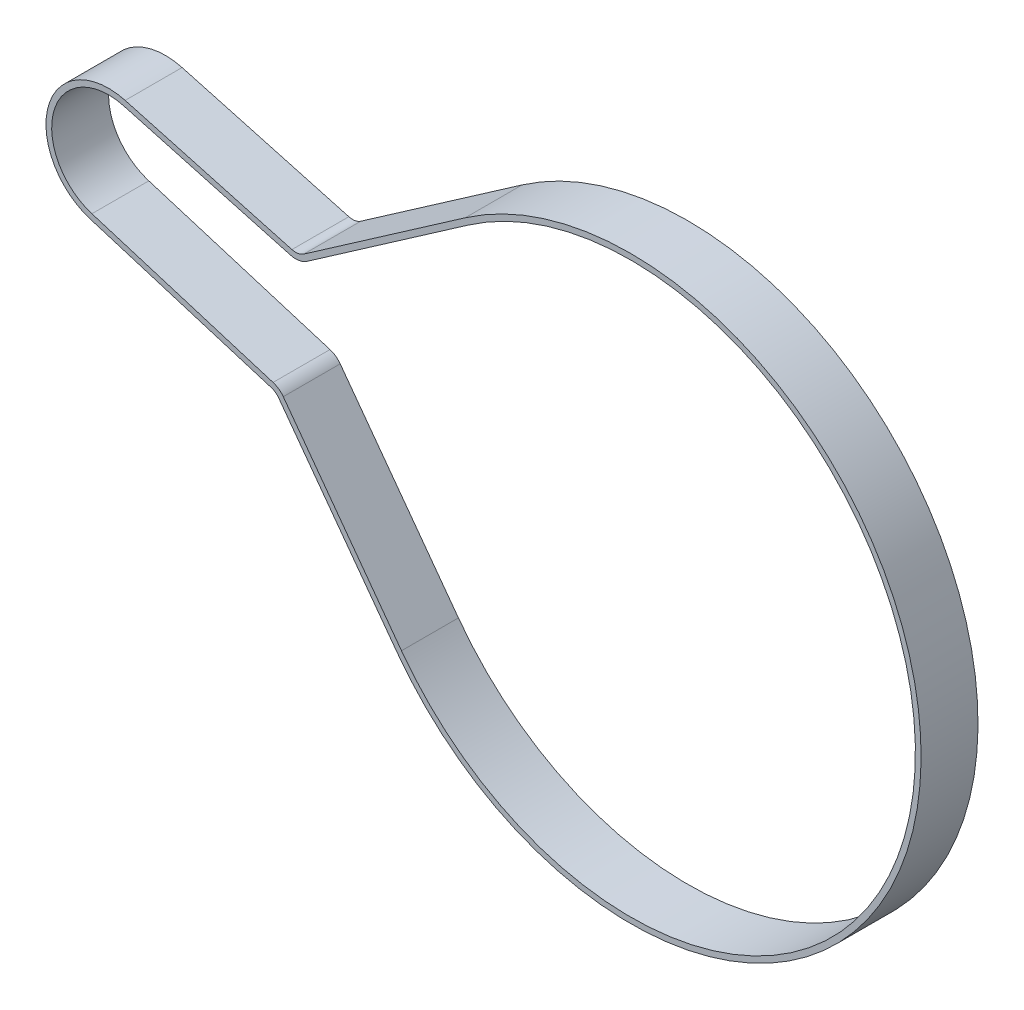
ISO-10303-21;
HEADER;
FILE_DESCRIPTION(('STEP AP214'),'2;1');
FILE_NAME('part.step','',(''),(''),'','','');
FILE_SCHEMA(('AUTOMOTIVE_DESIGN { 1 0 10303 214 1 1 1 1 }'));
ENDSEC;
DATA;
#1=APPLICATION_CONTEXT('core data for automotive mechanical design processes');
#2=APPLICATION_PROTOCOL_DEFINITION('international standard','automotive_design',2000,#1);
#3=PRODUCT_CONTEXT('',#1,'mechanical');
#4=PRODUCT('Part','Part','',(#3));
#5=PRODUCT_RELATED_PRODUCT_CATEGORY('part','',(#4));
#6=PRODUCT_DEFINITION_FORMATION('','',#4);
#7=PRODUCT_DEFINITION_CONTEXT('part definition',#1,'design');
#8=PRODUCT_DEFINITION('design','',#6,#7);
#9=PRODUCT_DEFINITION_SHAPE('','',#8);
#10=(LENGTH_UNIT() NAMED_UNIT(*) SI_UNIT(.MILLI.,.METRE.));
#11=(NAMED_UNIT(*) PLANE_ANGLE_UNIT() SI_UNIT($,.RADIAN.));
#12=(NAMED_UNIT(*) SI_UNIT($,.STERADIAN.) SOLID_ANGLE_UNIT());
#13=UNCERTAINTY_MEASURE_WITH_UNIT(LENGTH_MEASURE(1.E-05),#10,'distance_accuracy_value','');
#14=(GEOMETRIC_REPRESENTATION_CONTEXT(3) GLOBAL_UNCERTAINTY_ASSIGNED_CONTEXT((#13)) GLOBAL_UNIT_ASSIGNED_CONTEXT((#10,
#11,#12)) REPRESENTATION_CONTEXT('',''));
#15=CARTESIAN_POINT('',(0.,0.,0.));
#16=DIRECTION('',(0.,0.,1.));
#17=DIRECTION('',(1.,0.,0.));
#18=AXIS2_PLACEMENT_3D('',#15,#16,#17);
#19=CARTESIAN_POINT('',(0.,0.,-10.));
#20=DIRECTION('',(0.,0.,1.));
#21=DIRECTION('',(1.,0.,0.));
#22=AXIS2_PLACEMENT_3D('',#19,#20,#21);
#23=CYLINDRICAL_SURFACE('',#22,51.);
#24=CARTESIAN_POINT('',(0.,0.,0.));
#25=DIRECTION('',(0.,0.,1.));
#26=DIRECTION('',(1.,0.,0.));
#27=AXIS2_PLACEMENT_3D('',#24,#25,#26);
#28=CIRCLE('',#27,51.);
#29=CARTESIAN_POINT('',(-41.1042491431304,-30.1900762234789,0.));
#30=VERTEX_POINT('',#29);
#31=CARTESIAN_POINT('',(-29.0994235663367,41.8834519602543,0.));
#32=VERTEX_POINT('',#31);
#33=EDGE_CURVE('E253',#30,#32,#28,.T.);
#34=ORIENTED_EDGE('',*,*,#33,.F.);
#35=DIRECTION('',(0.,0.,1.));
#36=VECTOR('',#35,1.);
#37=CARTESIAN_POINT('',(-41.1042491431304,-30.1900762234789,-10.));
#38=LINE('',#37,#36);
#39=CARTESIAN_POINT('',(-41.1042491431304,-30.1900762234789,-10.));
#40=VERTEX_POINT('',#39);
#41=EDGE_CURVE('E12',#40,#30,#38,.T.);
#42=ORIENTED_EDGE('',*,*,#41,.F.);
#43=CARTESIAN_POINT('',(0.,0.,-10.));
#44=DIRECTION('',(0.,0.,1.));
#45=DIRECTION('',(1.,0.,0.));
#46=AXIS2_PLACEMENT_3D('',#43,#44,#45);
#47=CIRCLE('',#46,51.);
#48=CARTESIAN_POINT('',(-29.0994235663367,41.8834519602543,-10.));
#49=VERTEX_POINT('',#48);
#50=EDGE_CURVE('E265',#40,#49,#47,.T.);
#51=ORIENTED_EDGE('',*,*,#50,.T.);
#52=DIRECTION('',(0.,0.,1.));
#53=VECTOR('',#52,1.);
#54=CARTESIAN_POINT('',(-29.0994235663367,41.8834519602543,-10.));
#55=LINE('',#54,#53);
#56=EDGE_CURVE('E86',#49,#32,#55,.T.);
#57=ORIENTED_EDGE('',*,*,#56,.T.);
#58=EDGE_LOOP('',(#34,#42,#51,#57));
#59=FACE_BOUND('',#58,.T.);
#60=ADVANCED_FACE('F83',(#59),#23,.T.);
#61=CARTESIAN_POINT('',(-61.8709922911531,-1.91583875786189,-10.));
#62=DIRECTION('',(-0.805965669473144,-0.591962278891743,0.));
#63=DIRECTION('',(0.591962278891743,-0.805965669473144,0.));
#64=AXIS2_PLACEMENT_3D('',#61,#62,#63);
#65=PLANE('',#64);
#66=DIRECTION('',(0.591962278891743,-0.805965669473144,0.));
#67=VECTOR('',#66,1.);
#68=CARTESIAN_POINT('',(-61.8709922911531,-1.91583875786189,0.));
#69=LINE('',#68,#67);
#70=CARTESIAN_POINT('',(-61.8709922911531,-1.91583875786189,0.));
#71=VERTEX_POINT('',#70);
#72=EDGE_CURVE('E269',#71,#30,#69,.T.);
#73=ORIENTED_EDGE('',*,*,#72,.F.);
#74=DIRECTION('',(0.,0.,1.));
#75=VECTOR('',#74,1.);
#76=CARTESIAN_POINT('',(-61.8709922911531,-1.91583875786189,-10.));
#77=LINE('',#76,#75);
#78=CARTESIAN_POINT('',(-61.8709922911531,-1.91583875786189,-10.));
#79=VERTEX_POINT('',#78);
#80=EDGE_CURVE('E91',#79,#71,#77,.T.);
#81=ORIENTED_EDGE('',*,*,#80,.F.);
#82=DIRECTION('',(0.591962278891743,-0.805965669473144,0.));
#83=VECTOR('',#82,1.);
#84=CARTESIAN_POINT('',(-61.8709922911531,-1.91583875786189,-10.));
#85=LINE('',#84,#83);
#86=EDGE_CURVE('E287',#79,#40,#85,.T.);
#87=ORIENTED_EDGE('',*,*,#86,.T.);
#88=ORIENTED_EDGE('',*,*,#41,.T.);
#89=EDGE_LOOP('',(#73,#81,#87,#88));
#90=FACE_BOUND('',#89,.T.);
#91=ADVANCED_FACE('F334',(#90),#65,.T.);
#92=CARTESIAN_POINT('',(-63.885906464836,-3.39574445509125,-10.));
#93=DIRECTION('',(0.,0.,1.));
#94=DIRECTION('',(1.,0.,0.));
#95=AXIS2_PLACEMENT_3D('',#92,#93,#94);
#96=CYLINDRICAL_SURFACE('',#95,2.5);
#97=CARTESIAN_POINT('',(-63.885906464836,-3.39574445509125,0.));
#98=DIRECTION('',(0.,0.,1.));
#99=DIRECTION('',(1.,0.,0.));
#100=AXIS2_PLACEMENT_3D('',#97,#98,#99);
#101=CIRCLE('',#100,2.5);
#102=CARTESIAN_POINT('',(-63.153584859465,-1.00540869074623,0.));
#103=VERTEX_POINT('',#102);
#104=EDGE_CURVE('E307',#103,#71,#101,.F.);
#105=ORIENTED_EDGE('',*,*,#104,.F.);
#106=DIRECTION('',(0.,0.,1.));
#107=VECTOR('',#106,1.);
#108=CARTESIAN_POINT('',(-63.153584859465,-1.00540869074623,-10.));
#109=LINE('',#108,#107);
#110=CARTESIAN_POINT('',(-63.153584859465,-1.00540869074623,-10.));
#111=VERTEX_POINT('',#110);
#112=EDGE_CURVE('E313',#111,#103,#109,.T.);
#113=ORIENTED_EDGE('',*,*,#112,.F.);
#114=CARTESIAN_POINT('',(-63.885906464836,-3.39574445509125,-10.));
#115=DIRECTION('',(0.,0.,1.));
#116=DIRECTION('',(1.,0.,0.));
#117=AXIS2_PLACEMENT_3D('',#114,#115,#116);
#118=CIRCLE('',#117,2.5);
#119=EDGE_CURVE('E284',#111,#79,#118,.F.);
#120=ORIENTED_EDGE('',*,*,#119,.T.);
#121=ORIENTED_EDGE('',*,*,#80,.T.);
#122=EDGE_LOOP('',(#105,#113,#120,#121));
#123=FACE_BOUND('',#122,.T.);
#124=ADVANCED_FACE('F353',(#123),#96,.F.);
#125=CARTESIAN_POINT('',(-94.9827299605634,8.74601242159629,-10.));
#126=DIRECTION('',(-0.292928642148382,-0.956134305738009,0.));
#127=DIRECTION('',(0.956134305738009,-0.292928642148382,0.));
#128=AXIS2_PLACEMENT_3D('',#125,#126,#127);
#129=PLANE('',#128);
#130=DIRECTION('',(0.956134305738009,-0.292928642148382,0.));
#131=VECTOR('',#130,1.);
#132=CARTESIAN_POINT('',(-94.9827299605634,8.74601242159629,0.));
#133=LINE('',#132,#131);
#134=CARTESIAN_POINT('',(-94.9827299605634,8.74601242159629,0.));
#135=VERTEX_POINT('',#134);
#136=EDGE_CURVE('E304',#135,#103,#133,.T.);
#137=ORIENTED_EDGE('',*,*,#136,.F.);
#138=DIRECTION('',(0.,0.,1.));
#139=VECTOR('',#138,1.);
#140=CARTESIAN_POINT('',(-94.9827299605634,8.74601242159629,-10.));
#141=LINE('',#140,#139);
#142=CARTESIAN_POINT('',(-94.9827299605634,8.74601242159629,-10.));
#143=VERTEX_POINT('',#142);
#144=EDGE_CURVE('E315',#143,#135,#141,.T.);
#145=ORIENTED_EDGE('',*,*,#144,.F.);
#146=DIRECTION('',(0.956134305738009,-0.292928642148382,0.));
#147=VECTOR('',#146,1.);
#148=CARTESIAN_POINT('',(-94.9827299605634,8.74601242159629,-10.));
#149=LINE('',#148,#147);
#150=EDGE_CURVE('E281',#143,#111,#149,.T.);
#151=ORIENTED_EDGE('',*,*,#150,.T.);
#152=ORIENTED_EDGE('',*,*,#112,.T.);
#153=EDGE_LOOP('',(#137,#145,#151,#152));
#154=FACE_BOUND('',#153,.T.);
#155=ADVANCED_FACE('F351',(#154),#129,.T.);
#156=CARTESIAN_POINT('',(-91.7605148969312,19.2634897847144,-10.));
#157=DIRECTION('',(0.,0.,1.));
#158=DIRECTION('',(1.,0.,0.));
#159=AXIS2_PLACEMENT_3D('',#156,#157,#158);
#160=CYLINDRICAL_SURFACE('',#159,11.);
#161=CARTESIAN_POINT('',(-91.7605148969312,19.2634897847144,0.));
#162=DIRECTION('',(0.,0.,1.));
#163=DIRECTION('',(1.,0.,0.));
#164=AXIS2_PLACEMENT_3D('',#161,#162,#163);
#165=CIRCLE('',#164,11.);
#166=CARTESIAN_POINT('',(-88.8467151203059,29.8705520953515,0.));
#167=VERTEX_POINT('',#166);
#168=EDGE_CURVE('E301',#167,#135,#165,.T.);
#169=ORIENTED_EDGE('',*,*,#168,.F.);
#170=DIRECTION('',(0.,0.,1.));
#171=VECTOR('',#170,1.);
#172=CARTESIAN_POINT('',(-88.8467151203059,29.8705520953515,-10.));
#173=LINE('',#172,#171);
#174=CARTESIAN_POINT('',(-88.8467151203059,29.8705520953515,-10.));
#175=VERTEX_POINT('',#174);
#176=EDGE_CURVE('E317',#175,#167,#173,.T.);
#177=ORIENTED_EDGE('',*,*,#176,.F.);
#178=CARTESIAN_POINT('',(-91.7605148969312,19.2634897847144,-10.));
#179=DIRECTION('',(0.,0.,1.));
#180=DIRECTION('',(1.,0.,0.));
#181=AXIS2_PLACEMENT_3D('',#178,#179,#180);
#182=CIRCLE('',#181,11.);
#183=EDGE_CURVE('E278',#175,#143,#182,.T.);
#184=ORIENTED_EDGE('',*,*,#183,.T.);
#185=ORIENTED_EDGE('',*,*,#144,.T.);
#186=EDGE_LOOP('',(#169,#177,#184,#185));
#187=FACE_BOUND('',#186,.T.);
#188=ADVANCED_FACE('F347',(#187),#160,.T.);
#189=CARTESIAN_POINT('',(-59.5481336868111,21.8221219517156,-10.));
#190=DIRECTION('',(0.264890888784121,0.9642783918761,0.));
#191=DIRECTION('',(-0.964278391876101,0.264890888784121,0.));
#192=AXIS2_PLACEMENT_3D('',#189,#190,#191);
#193=PLANE('',#192);
#194=DIRECTION('',(-0.9642783918761,0.264890888784121,0.));
#195=VECTOR('',#194,1.);
#196=CARTESIAN_POINT('',(-59.5481336868111,21.8221219517156,0.));
#197=LINE('',#196,#195);
#198=CARTESIAN_POINT('',(-59.5481336868111,21.8221219517156,0.));
#199=VERTEX_POINT('',#198);
#200=EDGE_CURVE('E298',#199,#167,#197,.T.);
#201=ORIENTED_EDGE('',*,*,#200,.F.);
#202=DIRECTION('',(0.,0.,1.));
#203=VECTOR('',#202,1.);
#204=CARTESIAN_POINT('',(-59.5481336868111,21.8221219517156,-10.));
#205=LINE('',#204,#203);
#206=CARTESIAN_POINT('',(-59.5481336868111,21.8221219517156,-10.));
#207=VERTEX_POINT('',#206);
#208=EDGE_CURVE('E319',#207,#199,#205,.T.);
#209=ORIENTED_EDGE('',*,*,#208,.F.);
#210=DIRECTION('',(-0.9642783918761,0.264890888784121,0.));
#211=VECTOR('',#210,1.);
#212=CARTESIAN_POINT('',(-59.5481336868111,21.8221219517156,-10.));
#213=LINE('',#212,#211);
#214=EDGE_CURVE('E275',#207,#175,#213,.T.);
#215=ORIENTED_EDGE('',*,*,#214,.T.);
#216=ORIENTED_EDGE('',*,*,#176,.T.);
#217=EDGE_LOOP('',(#201,#209,#215,#216));
#218=FACE_BOUND('',#217,.T.);
#219=ADVANCED_FACE('F345',(#218),#193,.T.);
#220=CARTESIAN_POINT('',(-58.8859064648508,24.2328179314058,-10.));
#221=DIRECTION('',(0.,0.,1.));
#222=DIRECTION('',(1.,0.,0.));
#223=AXIS2_PLACEMENT_3D('',#220,#221,#222);
#224=CYLINDRICAL_SURFACE('',#223,2.5);
#225=CARTESIAN_POINT('',(-58.8859064648508,24.2328179314058,0.));
#226=DIRECTION('',(0.,0.,1.));
#227=DIRECTION('',(1.,0.,0.));
#228=AXIS2_PLACEMENT_3D('',#225,#226,#227);
#229=CIRCLE('',#228,2.5);
#230=CARTESIAN_POINT('',(-57.4594641331676,22.1797075411973,0.));
#231=VERTEX_POINT('',#230);
#232=EDGE_CURVE('E295',#231,#199,#229,.F.);
#233=ORIENTED_EDGE('',*,*,#232,.F.);
#234=DIRECTION('',(0.,0.,1.));
#235=VECTOR('',#234,1.);
#236=CARTESIAN_POINT('',(-57.4594641331676,22.1797075411973,-10.));
#237=LINE('',#236,#235);
#238=CARTESIAN_POINT('',(-57.4594641331676,22.1797075411973,-10.));
#239=VERTEX_POINT('',#238);
#240=EDGE_CURVE('E320',#239,#231,#237,.T.);
#241=ORIENTED_EDGE('',*,*,#240,.F.);
#242=CARTESIAN_POINT('',(-58.8859064648508,24.2328179314058,-10.));
#243=DIRECTION('',(0.,0.,1.));
#244=DIRECTION('',(1.,0.,0.));
#245=AXIS2_PLACEMENT_3D('',#242,#243,#244);
#246=CIRCLE('',#245,2.5);
#247=EDGE_CURVE('E272',#239,#207,#246,.F.);
#248=ORIENTED_EDGE('',*,*,#247,.T.);
#249=ORIENTED_EDGE('',*,*,#208,.T.);
#250=EDGE_LOOP('',(#233,#241,#248,#249));
#251=FACE_BOUND('',#250,.T.);
#252=ADVANCED_FACE('F341',(#251),#224,.F.);
#253=CARTESIAN_POINT('',(-29.0994235663367,41.8834519602543,-10.));
#254=DIRECTION('',(-0.570576932673268,0.821244156083417,0.));
#255=DIRECTION('',(-0.821244156083417,-0.570576932673268,0.));
#256=AXIS2_PLACEMENT_3D('',#253,#254,#255);
#257=PLANE('',#256);
#258=DIRECTION('',(-0.821244156083417,-0.570576932673268,0.));
#259=VECTOR('',#258,1.);
#260=CARTESIAN_POINT('',(-29.0994235663367,41.8834519602543,0.));
#261=LINE('',#260,#259);
#262=EDGE_CURVE('E292',#32,#231,#261,.T.);
#263=ORIENTED_EDGE('',*,*,#262,.F.);
#264=ORIENTED_EDGE('',*,*,#56,.F.);
#265=DIRECTION('',(-0.821244156083417,-0.570576932673268,0.));
#266=VECTOR('',#265,1.);
#267=CARTESIAN_POINT('',(-29.0994235663367,41.8834519602543,-10.));
#268=LINE('',#267,#266);
#269=EDGE_CURVE('E268',#49,#239,#268,.T.);
#270=ORIENTED_EDGE('',*,*,#269,.T.);
#271=ORIENTED_EDGE('',*,*,#240,.T.);
#272=EDGE_LOOP('',(#263,#264,#270,#271));
#273=FACE_BOUND('',#272,.T.);
#274=ADVANCED_FACE('F328',(#273),#257,.T.);
#275=CARTESIAN_POINT('',(0.,0.,-10.));
#276=DIRECTION('',(0.,0.,1.));
#277=DIRECTION('',(1.,0.,0.));
#278=AXIS2_PLACEMENT_3D('',#275,#276,#277);
#279=PLANE('',#278);
#280=DIRECTION('',(0.591962278891743,-0.805965669473144,0.));
#281=VECTOR('',#280,1.);
#282=CARTESIAN_POINT('',(-61.06502662168,-1.32387647897015,-10.));
#283=LINE('',#282,#281);
#284=CARTESIAN_POINT('',(-61.06502662168,-1.32387647897015,-10.));
#285=VERTEX_POINT('',#284);
#286=CARTESIAN_POINT('',(-40.2982834736572,-29.5981139445872,-10.));
#287=VERTEX_POINT('',#286);
#288=EDGE_CURVE('E204',#285,#287,#283,.T.);
#289=ORIENTED_EDGE('',*,*,#288,.T.);
#290=CARTESIAN_POINT('',(0.,0.,-10.));
#291=DIRECTION('',(0.,0.,1.));
#292=DIRECTION('',(1.,0.,0.));
#293=AXIS2_PLACEMENT_3D('',#290,#291,#292);
#294=CIRCLE('',#293,50.);
#295=CARTESIAN_POINT('',(-28.5288466336634,41.0622078041709,-10.));
#296=VERTEX_POINT('',#295);
#297=EDGE_CURVE('E198',#287,#296,#294,.T.);
#298=ORIENTED_EDGE('',*,*,#297,.T.);
#299=DIRECTION('',(-0.821244156083417,-0.570576932673268,0.));
#300=VECTOR('',#299,1.);
#301=CARTESIAN_POINT('',(-28.5288466336634,41.0622078041709,-10.));
#302=LINE('',#301,#300);
#303=CARTESIAN_POINT('',(-56.8888872004943,21.3584633851138,-10.));
#304=VERTEX_POINT('',#303);
#305=EDGE_CURVE('E207',#296,#304,#302,.T.);
#306=ORIENTED_EDGE('',*,*,#305,.T.);
#307=CARTESIAN_POINT('',(-58.8859064648508,24.2328179314058,-10.));
#308=DIRECTION('',(0.,0.,-1.));
#309=DIRECTION('',(-1.,0.,0.));
#310=AXIS2_PLACEMENT_3D('',#307,#308,#309);
#311=CIRCLE('',#310,3.5);
#312=CARTESIAN_POINT('',(-59.8130245755952,20.8578435598395,-10.));
#313=VERTEX_POINT('',#312);
#314=EDGE_CURVE('E99',#304,#313,#311,.T.);
#315=ORIENTED_EDGE('',*,*,#314,.T.);
#316=DIRECTION('',(-0.9642783918761,0.264890888784121,0.));
#317=VECTOR('',#316,1.);
#318=CARTESIAN_POINT('',(-59.8130245755952,20.8578435598395,-10.));
#319=LINE('',#318,#317);
#320=CARTESIAN_POINT('',(-89.11160600909,28.9062737034754,-10.));
#321=VERTEX_POINT('',#320);
#322=EDGE_CURVE('E222',#313,#321,#319,.T.);
#323=ORIENTED_EDGE('',*,*,#322,.T.);
#324=CARTESIAN_POINT('',(-91.7605148969312,19.2634897847144,-10.));
#325=DIRECTION('',(0.,0.,1.));
#326=DIRECTION('',(1.,0.,0.));
#327=AXIS2_PLACEMENT_3D('',#324,#325,#326);
#328=CIRCLE('',#327,10.);
#329=CARTESIAN_POINT('',(-94.689801318415,9.7021467273343,-10.));
#330=VERTEX_POINT('',#329);
#331=EDGE_CURVE('E225',#321,#330,#328,.T.);
#332=ORIENTED_EDGE('',*,*,#331,.T.);
#333=DIRECTION('',(0.956134305738009,-0.292928642148382,0.));
#334=VECTOR('',#333,1.);
#335=CARTESIAN_POINT('',(-94.689801318415,9.7021467273343,-10.));
#336=LINE('',#335,#334);
#337=CARTESIAN_POINT('',(-62.8606562173167,-0.0492743850082156,-10.));
#338=VERTEX_POINT('',#337);
#339=EDGE_CURVE('E228',#330,#338,#336,.T.);
#340=ORIENTED_EDGE('',*,*,#339,.T.);
#341=CARTESIAN_POINT('',(-63.885906464836,-3.39574445509125,-10.));
#342=DIRECTION('',(0.,0.,-1.));
#343=DIRECTION('',(-1.,0.,0.));
#344=AXIS2_PLACEMENT_3D('',#341,#342,#343);
#345=CIRCLE('',#344,3.5);
#346=EDGE_CURVE('E231',#338,#285,#345,.T.);
#347=ORIENTED_EDGE('',*,*,#346,.T.);
#348=EDGE_LOOP('',(#289,#298,#306,#315,#323,#332,#340,#347));
#349=FACE_BOUND('',#348,.T.);
#350=ORIENTED_EDGE('',*,*,#50,.F.);
#351=ORIENTED_EDGE('',*,*,#86,.F.);
#352=ORIENTED_EDGE('',*,*,#119,.F.);
#353=ORIENTED_EDGE('',*,*,#150,.F.);
#354=ORIENTED_EDGE('',*,*,#183,.F.);
#355=ORIENTED_EDGE('',*,*,#214,.F.);
#356=ORIENTED_EDGE('',*,*,#247,.F.);
#357=ORIENTED_EDGE('',*,*,#269,.F.);
#358=EDGE_LOOP('',(#350,#351,#352,#353,#354,#355,#356,#357));
#359=FACE_BOUND('',#358,.T.);
#360=ADVANCED_FACE('F211',(#349,#359),#279,.F.);
#361=CARTESIAN_POINT('',(0.,0.,0.));
#362=DIRECTION('',(0.,0.,1.));
#363=DIRECTION('',(1.,0.,0.));
#364=AXIS2_PLACEMENT_3D('',#361,#362,#363);
#365=PLANE('',#364);
#366=CARTESIAN_POINT('',(0.,0.,0.));
#367=DIRECTION('',(0.,0.,1.));
#368=DIRECTION('',(1.,0.,0.));
#369=AXIS2_PLACEMENT_3D('',#366,#367,#368);
#370=CIRCLE('',#369,50.);
#371=CARTESIAN_POINT('',(-40.2982834736572,-29.5981139445872,0.));
#372=VERTEX_POINT('',#371);
#373=CARTESIAN_POINT('',(-28.5288466336634,41.0622078041708,0.));
#374=VERTEX_POINT('',#373);
#375=EDGE_CURVE('E107',#372,#374,#370,.T.);
#376=ORIENTED_EDGE('',*,*,#375,.F.);
#377=DIRECTION('',(0.591962278891743,-0.805965669473144,0.));
#378=VECTOR('',#377,1.);
#379=CARTESIAN_POINT('',(-61.06502662168,-1.32387647897015,0.));
#380=LINE('',#379,#378);
#381=CARTESIAN_POINT('',(-61.06502662168,-1.32387647897015,0.));
#382=VERTEX_POINT('',#381);
#383=EDGE_CURVE('E215',#382,#372,#380,.T.);
#384=ORIENTED_EDGE('',*,*,#383,.F.);
#385=CARTESIAN_POINT('',(-63.885906464836,-3.39574445509125,0.));
#386=DIRECTION('',(0.,0.,-1.));
#387=DIRECTION('',(-1.,0.,0.));
#388=AXIS2_PLACEMENT_3D('',#385,#386,#387);
#389=CIRCLE('',#388,3.5);
#390=CARTESIAN_POINT('',(-62.8606562173167,-0.0492743850082156,0.));
#391=VERTEX_POINT('',#390);
#392=EDGE_CURVE('E218',#391,#382,#389,.T.);
#393=ORIENTED_EDGE('',*,*,#392,.F.);
#394=DIRECTION('',(0.956134305738009,-0.292928642148382,0.));
#395=VECTOR('',#394,1.);
#396=CARTESIAN_POINT('',(-94.689801318415,9.7021467273343,0.));
#397=LINE('',#396,#395);
#398=CARTESIAN_POINT('',(-94.689801318415,9.7021467273343,0.));
#399=VERTEX_POINT('',#398);
#400=EDGE_CURVE('E246',#399,#391,#397,.T.);
#401=ORIENTED_EDGE('',*,*,#400,.F.);
#402=CARTESIAN_POINT('',(-91.7605148969312,19.2634897847144,0.));
#403=DIRECTION('',(0.,0.,1.));
#404=DIRECTION('',(1.,0.,0.));
#405=AXIS2_PLACEMENT_3D('',#402,#403,#404);
#406=CIRCLE('',#405,10.);
#407=CARTESIAN_POINT('',(-89.11160600909,28.9062737034754,0.));
#408=VERTEX_POINT('',#407);
#409=EDGE_CURVE('E243',#408,#399,#406,.T.);
#410=ORIENTED_EDGE('',*,*,#409,.F.);
#411=DIRECTION('',(-0.9642783918761,0.264890888784121,0.));
#412=VECTOR('',#411,1.);
#413=CARTESIAN_POINT('',(-59.8130245755952,20.8578435598395,0.));
#414=LINE('',#413,#412);
#415=CARTESIAN_POINT('',(-59.8130245755952,20.8578435598395,0.));
#416=VERTEX_POINT('',#415);
#417=EDGE_CURVE('E240',#416,#408,#414,.T.);
#418=ORIENTED_EDGE('',*,*,#417,.F.);
#419=CARTESIAN_POINT('',(-58.8859064648508,24.2328179314058,0.));
#420=DIRECTION('',(0.,0.,-1.));
#421=DIRECTION('',(-1.,0.,0.));
#422=AXIS2_PLACEMENT_3D('',#419,#420,#421);
#423=CIRCLE('',#422,3.5);
#424=CARTESIAN_POINT('',(-56.8888872004943,21.3584633851139,0.));
#425=VERTEX_POINT('',#424);
#426=EDGE_CURVE('E237',#425,#416,#423,.T.);
#427=ORIENTED_EDGE('',*,*,#426,.F.);
#428=DIRECTION('',(-0.821244156083417,-0.570576932673268,0.));
#429=VECTOR('',#428,1.);
#430=CARTESIAN_POINT('',(-28.5288466336634,41.0622078041709,0.));
#431=LINE('',#430,#429);
#432=EDGE_CURVE('E235',#374,#425,#431,.T.);
#433=ORIENTED_EDGE('',*,*,#432,.F.);
#434=EDGE_LOOP('',(#376,#384,#393,#401,#410,#418,#427,#433));
#435=FACE_BOUND('',#434,.T.);
#436=ORIENTED_EDGE('',*,*,#33,.T.);
#437=ORIENTED_EDGE('',*,*,#262,.T.);
#438=ORIENTED_EDGE('',*,*,#232,.T.);
#439=ORIENTED_EDGE('',*,*,#200,.T.);
#440=ORIENTED_EDGE('',*,*,#168,.T.);
#441=ORIENTED_EDGE('',*,*,#136,.T.);
#442=ORIENTED_EDGE('',*,*,#104,.T.);
#443=ORIENTED_EDGE('',*,*,#72,.T.);
#444=EDGE_LOOP('',(#436,#437,#438,#439,#440,#441,#442,#443));
#445=FACE_BOUND('',#444,.T.);
#446=ADVANCED_FACE('F330',(#435,#445),#365,.T.);
#447=CARTESIAN_POINT('',(0.,0.,-10.));
#448=DIRECTION('',(0.,0.,1.));
#449=DIRECTION('',(1.,0.,0.));
#450=AXIS2_PLACEMENT_3D('',#447,#448,#449);
#451=CYLINDRICAL_SURFACE('',#450,50.);
#452=ORIENTED_EDGE('',*,*,#375,.T.);
#453=DIRECTION('',(0.,0.,1.));
#454=VECTOR('',#453,1.);
#455=CARTESIAN_POINT('',(-28.5288466336634,41.0622078041709,-10.));
#456=LINE('',#455,#454);
#457=EDGE_CURVE('E194',#296,#374,#456,.T.);
#458=ORIENTED_EDGE('',*,*,#457,.F.);
#459=ORIENTED_EDGE('',*,*,#297,.F.);
#460=DIRECTION('',(0.,0.,1.));
#461=VECTOR('',#460,1.);
#462=CARTESIAN_POINT('',(-40.2982834736572,-29.5981139445872,-10.));
#463=LINE('',#462,#461);
#464=EDGE_CURVE('E251',#287,#372,#463,.T.);
#465=ORIENTED_EDGE('',*,*,#464,.T.);
#466=EDGE_LOOP('',(#452,#458,#459,#465));
#467=FACE_BOUND('',#466,.T.);
#468=ADVANCED_FACE('F196',(#467),#451,.F.);
#469=CARTESIAN_POINT('',(-61.06502662168,-1.32387647897015,-10.));
#470=DIRECTION('',(-0.805965669473144,-0.591962278891743,0.));
#471=DIRECTION('',(0.591962278891743,-0.805965669473144,0.));
#472=AXIS2_PLACEMENT_3D('',#469,#470,#471);
#473=PLANE('',#472);
#474=ORIENTED_EDGE('',*,*,#383,.T.);
#475=ORIENTED_EDGE('',*,*,#464,.F.);
#476=ORIENTED_EDGE('',*,*,#288,.F.);
#477=DIRECTION('',(0.,0.,1.));
#478=VECTOR('',#477,1.);
#479=CARTESIAN_POINT('',(-61.06502662168,-1.32387647897015,-10.));
#480=LINE('',#479,#478);
#481=EDGE_CURVE('E254',#285,#382,#480,.T.);
#482=ORIENTED_EDGE('',*,*,#481,.T.);
#483=EDGE_LOOP('',(#474,#475,#476,#482));
#484=FACE_BOUND('',#483,.T.);
#485=ADVANCED_FACE('F436',(#484),#473,.F.);
#486=CARTESIAN_POINT('',(-63.885906464836,-3.39574445509125,-10.));
#487=DIRECTION('',(0.,0.,1.));
#488=DIRECTION('',(1.,0.,0.));
#489=AXIS2_PLACEMENT_3D('',#486,#487,#488);
#490=CYLINDRICAL_SURFACE('',#489,3.5);
#491=ORIENTED_EDGE('',*,*,#392,.T.);
#492=ORIENTED_EDGE('',*,*,#481,.F.);
#493=ORIENTED_EDGE('',*,*,#346,.F.);
#494=DIRECTION('',(0.,0.,1.));
#495=VECTOR('',#494,1.);
#496=CARTESIAN_POINT('',(-62.8606562173167,-0.0492743850082156,-10.));
#497=LINE('',#496,#495);
#498=EDGE_CURVE('E256',#338,#391,#497,.T.);
#499=ORIENTED_EDGE('',*,*,#498,.T.);
#500=EDGE_LOOP('',(#491,#492,#493,#499));
#501=FACE_BOUND('',#500,.T.);
#502=ADVANCED_FACE('F445',(#501),#490,.T.);
#503=CARTESIAN_POINT('',(-94.689801318415,9.7021467273343,-10.));
#504=DIRECTION('',(-0.292928642148382,-0.956134305738009,0.));
#505=DIRECTION('',(0.956134305738009,-0.292928642148382,0.));
#506=AXIS2_PLACEMENT_3D('',#503,#504,#505);
#507=PLANE('',#506);
#508=ORIENTED_EDGE('',*,*,#400,.T.);
#509=ORIENTED_EDGE('',*,*,#498,.F.);
#510=ORIENTED_EDGE('',*,*,#339,.F.);
#511=DIRECTION('',(0.,0.,1.));
#512=VECTOR('',#511,1.);
#513=CARTESIAN_POINT('',(-94.689801318415,9.7021467273343,-10.));
#514=LINE('',#513,#512);
#515=EDGE_CURVE('E258',#330,#399,#514,.T.);
#516=ORIENTED_EDGE('',*,*,#515,.T.);
#517=EDGE_LOOP('',(#508,#509,#510,#516));
#518=FACE_BOUND('',#517,.T.);
#519=ADVANCED_FACE('F455',(#518),#507,.F.);
#520=CARTESIAN_POINT('',(-91.7605148969312,19.2634897847144,-10.));
#521=DIRECTION('',(0.,0.,1.));
#522=DIRECTION('',(1.,0.,0.));
#523=AXIS2_PLACEMENT_3D('',#520,#521,#522);
#524=CYLINDRICAL_SURFACE('',#523,10.);
#525=ORIENTED_EDGE('',*,*,#409,.T.);
#526=ORIENTED_EDGE('',*,*,#515,.F.);
#527=ORIENTED_EDGE('',*,*,#331,.F.);
#528=DIRECTION('',(0.,0.,1.));
#529=VECTOR('',#528,1.);
#530=CARTESIAN_POINT('',(-89.11160600909,28.9062737034754,-10.));
#531=LINE('',#530,#529);
#532=EDGE_CURVE('E260',#321,#408,#531,.T.);
#533=ORIENTED_EDGE('',*,*,#532,.T.);
#534=EDGE_LOOP('',(#525,#526,#527,#533));
#535=FACE_BOUND('',#534,.T.);
#536=ADVANCED_FACE('F465',(#535),#524,.F.);
#537=CARTESIAN_POINT('',(-59.8130245755952,20.8578435598395,-10.));
#538=DIRECTION('',(0.264890888784121,0.9642783918761,0.));
#539=DIRECTION('',(-0.964278391876101,0.264890888784121,0.));
#540=AXIS2_PLACEMENT_3D('',#537,#538,#539);
#541=PLANE('',#540);
#542=ORIENTED_EDGE('',*,*,#417,.T.);
#543=ORIENTED_EDGE('',*,*,#532,.F.);
#544=ORIENTED_EDGE('',*,*,#322,.F.);
#545=DIRECTION('',(0.,0.,1.));
#546=VECTOR('',#545,1.);
#547=CARTESIAN_POINT('',(-59.8130245755952,20.8578435598395,-10.));
#548=LINE('',#547,#546);
#549=EDGE_CURVE('E262',#313,#416,#548,.T.);
#550=ORIENTED_EDGE('',*,*,#549,.T.);
#551=EDGE_LOOP('',(#542,#543,#544,#550));
#552=FACE_BOUND('',#551,.T.);
#553=ADVANCED_FACE('F475',(#552),#541,.F.);
#554=CARTESIAN_POINT('',(-58.8859064648508,24.2328179314058,-10.));
#555=DIRECTION('',(0.,0.,1.));
#556=DIRECTION('',(1.,0.,0.));
#557=AXIS2_PLACEMENT_3D('',#554,#555,#556);
#558=CYLINDRICAL_SURFACE('',#557,3.5);
#559=ORIENTED_EDGE('',*,*,#426,.T.);
#560=ORIENTED_EDGE('',*,*,#549,.F.);
#561=ORIENTED_EDGE('',*,*,#314,.F.);
#562=DIRECTION('',(0.,0.,1.));
#563=VECTOR('',#562,1.);
#564=CARTESIAN_POINT('',(-56.8888872004943,21.3584633851139,-10.));
#565=LINE('',#564,#563);
#566=EDGE_CURVE('E203',#304,#425,#565,.T.);
#567=ORIENTED_EDGE('',*,*,#566,.T.);
#568=EDGE_LOOP('',(#559,#560,#561,#567));
#569=FACE_BOUND('',#568,.T.);
#570=ADVANCED_FACE('F485',(#569),#558,.T.);
#571=CARTESIAN_POINT('',(-28.5288466336634,41.0622078041709,-10.));
#572=DIRECTION('',(-0.570576932673268,0.821244156083417,0.));
#573=DIRECTION('',(-0.821244156083417,-0.570576932673268,0.));
#574=AXIS2_PLACEMENT_3D('',#571,#572,#573);
#575=PLANE('',#574);
#576=ORIENTED_EDGE('',*,*,#432,.T.);
#577=ORIENTED_EDGE('',*,*,#566,.F.);
#578=ORIENTED_EDGE('',*,*,#305,.F.);
#579=ORIENTED_EDGE('',*,*,#457,.T.);
#580=EDGE_LOOP('',(#576,#577,#578,#579));
#581=FACE_BOUND('',#580,.T.);
#582=ADVANCED_FACE('F208',(#581),#575,.F.);
#583=CLOSED_SHELL('',(#60,#91,#124,#155,#188,#219,#252,#274,#360,#446,#468,#485,#502,#519,#536,
#553,#570,#582));
#584=MANIFOLD_SOLID_BREP('B2',#583);
#585=ADVANCED_BREP_SHAPE_REPRESENTATION('',(#18,#584),#14);
#586=SHAPE_DEFINITION_REPRESENTATION(#9,#585);
ENDSEC;
END-ISO-10303-21;
